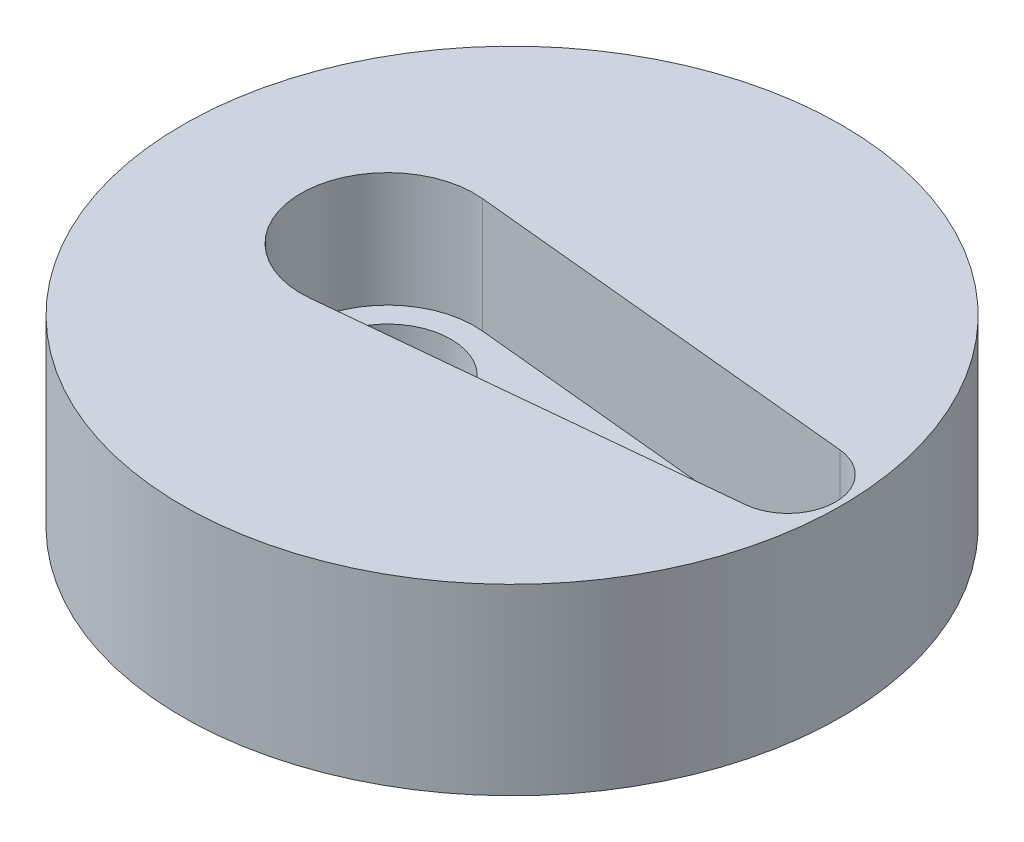
ISO-10303-21;
HEADER;
FILE_DESCRIPTION(('STEP AP214'),'2;1');
FILE_NAME('part.step','',(''),(''),'','','');
FILE_SCHEMA(('AUTOMOTIVE_DESIGN { 1 0 10303 214 1 1 1 1 }'));
ENDSEC;
DATA;
#1=APPLICATION_CONTEXT('core data for automotive mechanical design processes');
#2=APPLICATION_PROTOCOL_DEFINITION('international standard','automotive_design',2000,#1);
#3=PRODUCT_CONTEXT('',#1,'mechanical');
#4=PRODUCT('Part','Part','',(#3));
#5=PRODUCT_RELATED_PRODUCT_CATEGORY('part','',(#4));
#6=PRODUCT_DEFINITION_FORMATION('','',#4);
#7=PRODUCT_DEFINITION_CONTEXT('part definition',#1,'design');
#8=PRODUCT_DEFINITION('design','',#6,#7);
#9=PRODUCT_DEFINITION_SHAPE('','',#8);
#10=(LENGTH_UNIT() NAMED_UNIT(*) SI_UNIT(.MILLI.,.METRE.));
#11=(NAMED_UNIT(*) PLANE_ANGLE_UNIT() SI_UNIT($,.RADIAN.));
#12=(NAMED_UNIT(*) SI_UNIT($,.STERADIAN.) SOLID_ANGLE_UNIT());
#13=UNCERTAINTY_MEASURE_WITH_UNIT(LENGTH_MEASURE(1.E-05),#10,'distance_accuracy_value','');
#14=(GEOMETRIC_REPRESENTATION_CONTEXT(3) GLOBAL_UNCERTAINTY_ASSIGNED_CONTEXT((#13)) GLOBAL_UNIT_ASSIGNED_CONTEXT((#10,
#11,#12)) REPRESENTATION_CONTEXT('',''));
#15=CARTESIAN_POINT('',(0.,0.,0.));
#16=DIRECTION('',(0.,0.,1.));
#17=DIRECTION('',(1.,0.,0.));
#18=AXIS2_PLACEMENT_3D('',#15,#16,#17);
#19=CARTESIAN_POINT('',(46.4,2.8,0.));
#20=DIRECTION('',(0.,-1.,0.));
#21=DIRECTION('',(0.,0.,-1.));
#22=AXIS2_PLACEMENT_3D('',#19,#20,#21);
#23=CYLINDRICAL_SURFACE('',#22,1.95000000000018);
#24=CARTESIAN_POINT('',(46.4,-1.9,0.));
#25=DIRECTION('',(0.,-1.,0.));
#26=DIRECTION('',(0.,0.,-1.));
#27=AXIS2_PLACEMENT_3D('',#24,#25,#26);
#28=CIRCLE('',#27,1.95000000000018);
#29=CARTESIAN_POINT('',(46.5902439024391,-1.9,1.94069762136853));
#30=VERTEX_POINT('',#29);
#31=CARTESIAN_POINT('',(46.5902439024391,-1.9,-1.94069762136853));
#32=VERTEX_POINT('',#31);
#33=EDGE_CURVE('E58',#30,#32,#28,.F.);
#34=ORIENTED_EDGE('',*,*,#33,.F.);
#35=DIRECTION('',(0.,-1.,0.));
#36=VECTOR('',#35,1.);
#37=CARTESIAN_POINT('',(46.5902439024391,2.8,1.94069762136853));
#38=LINE('',#37,#36);
#39=CARTESIAN_POINT('',(46.5902439024391,2.8,1.94069762136853));
#40=VERTEX_POINT('',#39);
#41=EDGE_CURVE('E11',#40,#30,#38,.T.);
#42=ORIENTED_EDGE('',*,*,#41,.F.);
#43=CARTESIAN_POINT('',(46.4,2.8,0.));
#44=DIRECTION('',(0.,-1.,0.));
#45=DIRECTION('',(0.,0.,-1.));
#46=AXIS2_PLACEMENT_3D('',#43,#44,#45);
#47=CIRCLE('',#46,1.95000000000018);
#48=CARTESIAN_POINT('',(46.5902439024391,2.8,-1.94069762136853));
#49=VERTEX_POINT('',#48);
#50=EDGE_CURVE('E104',#49,#40,#47,.T.);
#51=ORIENTED_EDGE('',*,*,#50,.F.);
#52=DIRECTION('',(0.,-1.,0.));
#53=VECTOR('',#52,1.);
#54=CARTESIAN_POINT('',(46.5902439024391,2.8,-1.94069762136853));
#55=LINE('',#54,#53);
#56=EDGE_CURVE('E45',#49,#32,#55,.T.);
#57=ORIENTED_EDGE('',*,*,#56,.T.);
#58=EDGE_LOOP('',(#34,#42,#51,#57));
#59=FACE_BOUND('',#58,.T.);
#60=ADVANCED_FACE('F42',(#59),#23,.F.);
#61=CARTESIAN_POINT('',(0.631885782272356,2.8,6.44593187435073));
#62=DIRECTION('',(0.0975609756097453,0.,0.995229549419668));
#63=DIRECTION('',(0.995229549419668,0.,-0.0975609756097453));
#64=AXIS2_PLACEMENT_3D('',#61,#62,#63);
#65=PLANE('',#64);
#66=DIRECTION('',(0.995229549419668,0.,-0.0975609756097453));
#67=VECTOR('',#66,1.);
#68=CARTESIAN_POINT('',(0.631885782272356,-1.9,6.44593187435073));
#69=LINE('',#68,#67);
#70=CARTESIAN_POINT('',(30.3463414634147,-1.9,3.53306490043982));
#71=VERTEX_POINT('',#70);
#72=EDGE_CURVE('E64',#71,#30,#69,.T.);
#73=ORIENTED_EDGE('',*,*,#72,.F.);
#74=DIRECTION('',(0.,-1.,0.));
#75=VECTOR('',#74,1.);
#76=CARTESIAN_POINT('',(30.3463414634147,2.8,3.53306490043982));
#77=LINE('',#76,#75);
#78=CARTESIAN_POINT('',(30.3463414634147,2.8,3.53306490043982));
#79=VERTEX_POINT('',#78);
#80=EDGE_CURVE('E50',#79,#71,#77,.T.);
#81=ORIENTED_EDGE('',*,*,#80,.F.);
#82=DIRECTION('',(-0.995229549419668,0.,0.0975609756097453));
#83=VECTOR('',#82,1.);
#84=CARTESIAN_POINT('',(0.631885782272356,2.8,6.44593187435073));
#85=LINE('',#84,#83);
#86=EDGE_CURVE('E113',#40,#79,#85,.T.);
#87=ORIENTED_EDGE('',*,*,#86,.F.);
#88=ORIENTED_EDGE('',*,*,#41,.T.);
#89=EDGE_LOOP('',(#73,#81,#87,#88));
#90=FACE_BOUND('',#89,.T.);
#91=ADVANCED_FACE('F124',(#90),#65,.F.);
#92=CARTESIAN_POINT('',(30.,2.8,0.));
#93=DIRECTION('',(0.,-1.,0.));
#94=DIRECTION('',(0.,0.,-1.));
#95=AXIS2_PLACEMENT_3D('',#92,#93,#94);
#96=CYLINDRICAL_SURFACE('',#95,3.55);
#97=CARTESIAN_POINT('',(30.,-1.9,0.));
#98=DIRECTION('',(0.,-1.,0.));
#99=DIRECTION('',(0.,0.,-1.));
#100=AXIS2_PLACEMENT_3D('',#97,#98,#99);
#101=CIRCLE('',#100,3.55);
#102=CARTESIAN_POINT('',(30.3463414634146,-1.9,-3.53306490043981));
#103=VERTEX_POINT('',#102);
#104=EDGE_CURVE('E96',#103,#71,#101,.F.);
#105=ORIENTED_EDGE('',*,*,#104,.F.);
#106=DIRECTION('',(0.,-1.,0.));
#107=VECTOR('',#106,1.);
#108=CARTESIAN_POINT('',(30.3463414634147,2.8,-3.53306490044016));
#109=LINE('',#108,#107);
#110=CARTESIAN_POINT('',(30.3463414634147,2.8,-3.53306490044016));
#111=VERTEX_POINT('',#110);
#112=EDGE_CURVE('E86',#111,#103,#109,.T.);
#113=ORIENTED_EDGE('',*,*,#112,.F.);
#114=CARTESIAN_POINT('',(30.,2.8,0.));
#115=DIRECTION('',(0.,-1.,0.));
#116=DIRECTION('',(0.,0.,-1.));
#117=AXIS2_PLACEMENT_3D('',#114,#115,#116);
#118=CIRCLE('',#117,3.55);
#119=EDGE_CURVE('E111',#79,#111,#118,.T.);
#120=ORIENTED_EDGE('',*,*,#119,.F.);
#121=ORIENTED_EDGE('',*,*,#80,.T.);
#122=EDGE_LOOP('',(#105,#113,#120,#121));
#123=FACE_BOUND('',#122,.T.);
#124=ADVANCED_FACE('F97',(#123),#96,.F.);
#125=CARTESIAN_POINT('',(0.631885782272584,2.8,-6.44593187435167));
#126=DIRECTION('',(0.097560975609766,0.,-0.995229549419666));
#127=DIRECTION('',(-0.995229549419666,0.,-0.097560975609766));
#128=AXIS2_PLACEMENT_3D('',#125,#126,#127);
#129=PLANE('',#128);
#130=DIRECTION('',(-0.995229549419666,0.,-0.097560975609766));
#131=VECTOR('',#130,1.);
#132=CARTESIAN_POINT('',(0.631885782272583,-1.9,-6.44593187435167));
#133=LINE('',#132,#131);
#134=EDGE_CURVE('E91',#32,#103,#133,.T.);
#135=ORIENTED_EDGE('',*,*,#134,.F.);
#136=ORIENTED_EDGE('',*,*,#56,.F.);
#137=DIRECTION('',(0.995229549419666,0.,0.097560975609766));
#138=VECTOR('',#137,1.);
#139=CARTESIAN_POINT('',(0.631885782272584,2.8,-6.44593187435167));
#140=LINE('',#139,#138);
#141=EDGE_CURVE('E92',#111,#49,#140,.T.);
#142=ORIENTED_EDGE('',*,*,#141,.F.);
#143=ORIENTED_EDGE('',*,*,#112,.T.);
#144=EDGE_LOOP('',(#135,#136,#142,#143));
#145=FACE_BOUND('',#144,.T.);
#146=ADVANCED_FACE('F88',(#145),#129,.F.);
#147=CARTESIAN_POINT('',(35.1,2.8,0.));
#148=DIRECTION('',(0.,-1.,0.));
#149=DIRECTION('',(0.,0.,-1.));
#150=AXIS2_PLACEMENT_3D('',#147,#148,#149);
#151=CYLINDRICAL_SURFACE('',#150,13.5);
#152=CARTESIAN_POINT('',(35.1,2.8,0.));
#153=DIRECTION('',(0.,-1.,0.));
#154=DIRECTION('',(0.,0.,-1.));
#155=AXIS2_PLACEMENT_3D('',#152,#153,#154);
#156=CIRCLE('',#155,13.5);
#157=CARTESIAN_POINT('',(35.1,2.8,-13.5));
#158=VERTEX_POINT('',#157);
#159=EDGE_CURVE('E115',#158,#158,#156,.T.);
#160=ORIENTED_EDGE('',*,*,#159,.T.);
#161=EDGE_LOOP('',(#160));
#162=FACE_BOUND('',#161,.T.);
#163=CARTESIAN_POINT('',(35.1,-4.7,0.));
#164=DIRECTION('',(0.,-1.,0.));
#165=DIRECTION('',(0.,0.,-1.));
#166=AXIS2_PLACEMENT_3D('',#163,#164,#165);
#167=CIRCLE('',#166,13.5);
#168=CARTESIAN_POINT('',(35.1,-4.7,-13.5));
#169=VERTEX_POINT('',#168);
#170=EDGE_CURVE('E101',#169,#169,#167,.T.);
#171=ORIENTED_EDGE('',*,*,#170,.F.);
#172=EDGE_LOOP('',(#171));
#173=FACE_BOUND('',#172,.T.);
#174=ADVANCED_FACE('F133',(#162,#173),#151,.T.);
#175=CARTESIAN_POINT('',(0.,2.8,0.));
#176=DIRECTION('',(0.,-1.,0.));
#177=DIRECTION('',(0.,0.,-1.));
#178=AXIS2_PLACEMENT_3D('',#175,#176,#177);
#179=PLANE('',#178);
#180=ORIENTED_EDGE('',*,*,#50,.T.);
#181=ORIENTED_EDGE('',*,*,#86,.T.);
#182=ORIENTED_EDGE('',*,*,#119,.T.);
#183=ORIENTED_EDGE('',*,*,#141,.T.);
#184=EDGE_LOOP('',(#180,#181,#182,#183));
#185=FACE_BOUND('',#184,.T.);
#186=ORIENTED_EDGE('',*,*,#159,.F.);
#187=EDGE_LOOP('',(#186));
#188=FACE_BOUND('',#187,.T.);
#189=ADVANCED_FACE('F122',(#185,#188),#179,.F.);
#190=CARTESIAN_POINT('',(0.,-4.7,0.));
#191=DIRECTION('',(0.,-1.,0.));
#192=DIRECTION('',(0.,0.,-1.));
#193=AXIS2_PLACEMENT_3D('',#190,#191,#192);
#194=PLANE('',#193);
#195=CARTESIAN_POINT('',(30.,-4.7,0.));
#196=DIRECTION('',(0.,-1.,0.));
#197=DIRECTION('',(0.,0.,-1.));
#198=AXIS2_PLACEMENT_3D('',#195,#196,#197);
#199=CIRCLE('',#198,2.59999999999999);
#200=CARTESIAN_POINT('',(30.,-4.7,-2.59999999999999));
#201=VERTEX_POINT('',#200);
#202=EDGE_CURVE('E180',#201,#201,#199,.T.);
#203=ORIENTED_EDGE('',*,*,#202,.F.);
#204=EDGE_LOOP('',(#203));
#205=FACE_BOUND('',#204,.T.);
#206=CARTESIAN_POINT('',(35.1,-4.7,0.));
#207=DIRECTION('',(0.,-1.,0.));
#208=DIRECTION('',(0.,0.,-1.));
#209=AXIS2_PLACEMENT_3D('',#206,#207,#208);
#210=CIRCLE('',#209,1.3);
#211=CARTESIAN_POINT('',(35.1,-4.7,-1.3));
#212=VERTEX_POINT('',#211);
#213=EDGE_CURVE('E181',#212,#212,#210,.T.);
#214=ORIENTED_EDGE('',*,*,#213,.F.);
#215=EDGE_LOOP('',(#214));
#216=FACE_BOUND('',#215,.T.);
#217=CARTESIAN_POINT('',(38.96,-4.7,0.));
#218=DIRECTION('',(0.,-1.,0.));
#219=DIRECTION('',(0.,0.,-1.));
#220=AXIS2_PLACEMENT_3D('',#217,#218,#219);
#221=CIRCLE('',#220,1.3);
#222=CARTESIAN_POINT('',(38.96,-4.7,-1.3));
#223=VERTEX_POINT('',#222);
#224=EDGE_CURVE('E189',#223,#223,#221,.T.);
#225=ORIENTED_EDGE('',*,*,#224,.F.);
#226=EDGE_LOOP('',(#225));
#227=FACE_BOUND('',#226,.T.);
#228=CARTESIAN_POINT('',(42.82,-4.7,0.));
#229=DIRECTION('',(0.,-1.,0.));
#230=DIRECTION('',(0.,0.,-1.));
#231=AXIS2_PLACEMENT_3D('',#228,#229,#230);
#232=CIRCLE('',#231,1.3);
#233=CARTESIAN_POINT('',(42.82,-4.7,-1.3));
#234=VERTEX_POINT('',#233);
#235=EDGE_CURVE('E194',#234,#234,#232,.T.);
#236=ORIENTED_EDGE('',*,*,#235,.F.);
#237=EDGE_LOOP('',(#236));
#238=FACE_BOUND('',#237,.T.);
#239=ORIENTED_EDGE('',*,*,#170,.T.);
#240=EDGE_LOOP('',(#239));
#241=FACE_BOUND('',#240,.T.);
#242=ADVANCED_FACE('F144',(#205,#216,#227,#238,#241),#194,.T.);
#243=CARTESIAN_POINT('',(0.,-1.9,0.));
#244=DIRECTION('',(0.,-1.,0.));
#245=DIRECTION('',(0.,0.,-1.));
#246=AXIS2_PLACEMENT_3D('',#243,#244,#245);
#247=PLANE('',#246);
#248=CARTESIAN_POINT('',(30.,-1.9,0.));
#249=DIRECTION('',(0.,-1.,0.));
#250=DIRECTION('',(0.,0.,-1.));
#251=AXIS2_PLACEMENT_3D('',#248,#249,#250);
#252=CIRCLE('',#251,2.59999999999999);
#253=CARTESIAN_POINT('',(30.,-1.9,-2.59999999999999));
#254=VERTEX_POINT('',#253);
#255=EDGE_CURVE('E178',#254,#254,#252,.F.);
#256=ORIENTED_EDGE('',*,*,#255,.F.);
#257=EDGE_LOOP('',(#256));
#258=FACE_BOUND('',#257,.T.);
#259=CARTESIAN_POINT('',(35.1,-1.9,0.));
#260=DIRECTION('',(0.,-1.,0.));
#261=DIRECTION('',(0.,0.,-1.));
#262=AXIS2_PLACEMENT_3D('',#259,#260,#261);
#263=CIRCLE('',#262,1.3);
#264=CARTESIAN_POINT('',(35.1,-1.9,-1.3));
#265=VERTEX_POINT('',#264);
#266=EDGE_CURVE('E185',#265,#265,#263,.F.);
#267=ORIENTED_EDGE('',*,*,#266,.F.);
#268=EDGE_LOOP('',(#267));
#269=FACE_BOUND('',#268,.T.);
#270=CARTESIAN_POINT('',(38.96,-1.9,0.));
#271=DIRECTION('',(0.,-1.,0.));
#272=DIRECTION('',(0.,0.,-1.));
#273=AXIS2_PLACEMENT_3D('',#270,#271,#272);
#274=CIRCLE('',#273,1.3);
#275=CARTESIAN_POINT('',(38.96,-1.9,-1.3));
#276=VERTEX_POINT('',#275);
#277=EDGE_CURVE('E191',#276,#276,#274,.F.);
#278=ORIENTED_EDGE('',*,*,#277,.F.);
#279=EDGE_LOOP('',(#278));
#280=FACE_BOUND('',#279,.T.);
#281=CARTESIAN_POINT('',(42.82,-1.9,0.));
#282=DIRECTION('',(0.,-1.,0.));
#283=DIRECTION('',(0.,0.,-1.));
#284=AXIS2_PLACEMENT_3D('',#281,#282,#283);
#285=CIRCLE('',#284,1.3);
#286=CARTESIAN_POINT('',(42.82,-1.9,-1.3));
#287=VERTEX_POINT('',#286);
#288=EDGE_CURVE('E197',#287,#287,#285,.F.);
#289=ORIENTED_EDGE('',*,*,#288,.F.);
#290=EDGE_LOOP('',(#289));
#291=FACE_BOUND('',#290,.T.);
#292=ORIENTED_EDGE('',*,*,#33,.T.);
#293=ORIENTED_EDGE('',*,*,#134,.T.);
#294=ORIENTED_EDGE('',*,*,#104,.T.);
#295=ORIENTED_EDGE('',*,*,#72,.T.);
#296=EDGE_LOOP('',(#292,#293,#294,#295));
#297=FACE_BOUND('',#296,.T.);
#298=ADVANCED_FACE('F100',(#258,#269,#280,#291,#297),#247,.F.);
#299=CARTESIAN_POINT('',(42.82,5.45391052434007,0.));
#300=DIRECTION('',(0.,-1.,0.));
#301=DIRECTION('',(0.,0.,-1.));
#302=AXIS2_PLACEMENT_3D('',#299,#300,#301);
#303=CYLINDRICAL_SURFACE('',#302,1.3);
#304=ORIENTED_EDGE('',*,*,#288,.T.);
#305=EDGE_LOOP('',(#304));
#306=FACE_BOUND('',#305,.T.);
#307=ORIENTED_EDGE('',*,*,#235,.T.);
#308=EDGE_LOOP('',(#307));
#309=FACE_BOUND('',#308,.T.);
#310=ADVANCED_FACE('F153',(#306,#309),#303,.F.);
#311=CARTESIAN_POINT('',(38.96,5.45391052434007,0.));
#312=DIRECTION('',(0.,-1.,0.));
#313=DIRECTION('',(0.,0.,-1.));
#314=AXIS2_PLACEMENT_3D('',#311,#312,#313);
#315=CYLINDRICAL_SURFACE('',#314,1.3);
#316=ORIENTED_EDGE('',*,*,#277,.T.);
#317=EDGE_LOOP('',(#316));
#318=FACE_BOUND('',#317,.T.);
#319=ORIENTED_EDGE('',*,*,#224,.T.);
#320=EDGE_LOOP('',(#319));
#321=FACE_BOUND('',#320,.T.);
#322=ADVANCED_FACE('F161',(#318,#321),#315,.F.);
#323=CARTESIAN_POINT('',(35.1,5.45391052434007,0.));
#324=DIRECTION('',(0.,-1.,0.));
#325=DIRECTION('',(0.,0.,-1.));
#326=AXIS2_PLACEMENT_3D('',#323,#324,#325);
#327=CYLINDRICAL_SURFACE('',#326,1.3);
#328=ORIENTED_EDGE('',*,*,#266,.T.);
#329=EDGE_LOOP('',(#328));
#330=FACE_BOUND('',#329,.T.);
#331=ORIENTED_EDGE('',*,*,#213,.T.);
#332=EDGE_LOOP('',(#331));
#333=FACE_BOUND('',#332,.T.);
#334=ADVANCED_FACE('F165',(#330,#333),#327,.F.);
#335=CARTESIAN_POINT('',(30.,5.45391052434007,0.));
#336=DIRECTION('',(0.,-1.,0.));
#337=DIRECTION('',(0.,0.,-1.));
#338=AXIS2_PLACEMENT_3D('',#335,#336,#337);
#339=CYLINDRICAL_SURFACE('',#338,2.59999999999999);
#340=ORIENTED_EDGE('',*,*,#255,.T.);
#341=EDGE_LOOP('',(#340));
#342=FACE_BOUND('',#341,.T.);
#343=ORIENTED_EDGE('',*,*,#202,.T.);
#344=EDGE_LOOP('',(#343));
#345=FACE_BOUND('',#344,.T.);
#346=ADVANCED_FACE('F169',(#342,#345),#339,.F.);
#347=CLOSED_SHELL('',(#60,#91,#124,#146,#174,#189,#242,#298,#310,#322,#334,#346));
#348=MANIFOLD_SOLID_BREP('B2',#347);
#349=ADVANCED_BREP_SHAPE_REPRESENTATION('',(#18,#348),#14);
#350=SHAPE_DEFINITION_REPRESENTATION(#9,#349);
ENDSEC;
END-ISO-10303-21;
